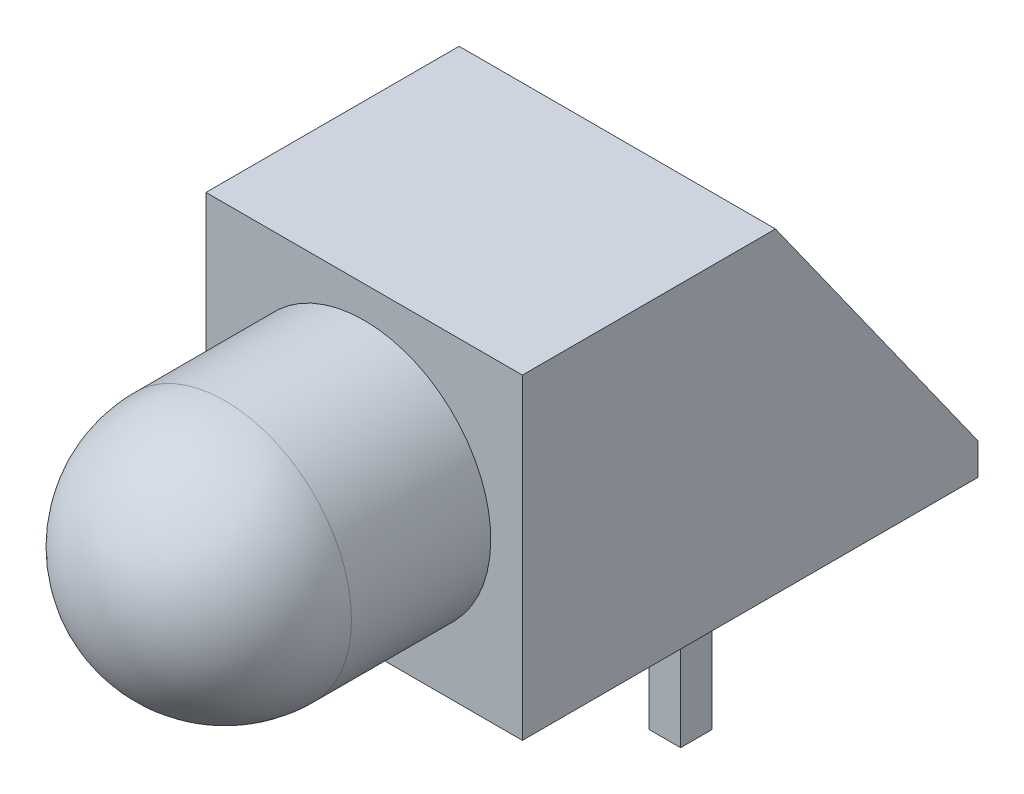
ISO-10303-21;
HEADER;
FILE_DESCRIPTION(('STEP AP214'),'2;1');
FILE_NAME('part.step','',(''),(''),'','','');
FILE_SCHEMA(('AUTOMOTIVE_DESIGN { 1 0 10303 214 1 1 1 1 }'));
ENDSEC;
DATA;
#1=APPLICATION_CONTEXT('core data for automotive mechanical design processes');
#2=APPLICATION_PROTOCOL_DEFINITION('international standard','automotive_design',2000,#1);
#3=PRODUCT_CONTEXT('',#1,'mechanical');
#4=PRODUCT('Part','Part','',(#3));
#5=PRODUCT_RELATED_PRODUCT_CATEGORY('part','',(#4));
#6=PRODUCT_DEFINITION_FORMATION('','',#4);
#7=PRODUCT_DEFINITION_CONTEXT('part definition',#1,'design');
#8=PRODUCT_DEFINITION('design','',#6,#7);
#9=PRODUCT_DEFINITION_SHAPE('','',#8);
#10=(LENGTH_UNIT() NAMED_UNIT(*) SI_UNIT(.MILLI.,.METRE.));
#11=(NAMED_UNIT(*) PLANE_ANGLE_UNIT() SI_UNIT($,.RADIAN.));
#12=(NAMED_UNIT(*) SI_UNIT($,.STERADIAN.) SOLID_ANGLE_UNIT());
#13=UNCERTAINTY_MEASURE_WITH_UNIT(LENGTH_MEASURE(1.E-05),#10,'distance_accuracy_value','');
#14=(GEOMETRIC_REPRESENTATION_CONTEXT(3) GLOBAL_UNCERTAINTY_ASSIGNED_CONTEXT((#13)) GLOBAL_UNIT_ASSIGNED_CONTEXT((#10,
#11,#12)) REPRESENTATION_CONTEXT('',''));
#15=CARTESIAN_POINT('',(0.,0.,0.));
#16=DIRECTION('',(0.,0.,1.));
#17=DIRECTION('',(1.,0.,0.));
#18=AXIS2_PLACEMENT_3D('',#15,#16,#17);
#19=CARTESIAN_POINT('',(1.27,-3.2766,0.));
#20=DIRECTION('',(0.,-1.,0.));
#21=DIRECTION('',(0.,0.,-1.));
#22=AXIS2_PLACEMENT_3D('',#19,#20,#21);
#23=PLANE('',#22);
#24=CARTESIAN_POINT('',(1.27,-3.2766,0.));
#25=DIRECTION('',(0.,-1.,0.));
#26=DIRECTION('',(0.,0.,-1.));
#27=AXIS2_PLACEMENT_3D('',#24,#25,#26);
#28=CIRCLE('',#27,0.105833333333333);
#29=CARTESIAN_POINT('',(1.27,-3.2766,-0.105833333333333));
#30=VERTEX_POINT('',#29);
#31=EDGE_CURVE('P0_E20',#30,#30,#28,.T.);
#32=ORIENTED_EDGE('',*,*,#31,.T.);
#33=EDGE_LOOP('',(#32));
#34=FACE_BOUND('',#33,.T.);
#35=ADVANCED_FACE('P0_F17',(#34),#23,.T.);
#36=CARTESIAN_POINT('',(1.27,-3.2766,0.));
#37=DIRECTION('',(0.,-1.,0.));
#38=DIRECTION('',(0.,0.,-1.));
#39=AXIS2_PLACEMENT_3D('',#36,#37,#38);
#40=CYLINDRICAL_SURFACE('',#39,0.105833333333333);
#41=ORIENTED_EDGE('',*,*,#31,.F.);
#42=EDGE_LOOP('',(#41));
#43=FACE_BOUND('',#42,.T.);
#44=CARTESIAN_POINT('',(1.27,-3.302,0.));
#45=DIRECTION('',(0.,-1.,0.));
#46=DIRECTION('',(0.,0.,-1.));
#47=AXIS2_PLACEMENT_3D('',#44,#45,#46);
#48=CIRCLE('',#47,0.105833333333333);
#49=CARTESIAN_POINT('',(1.27,-3.302,-0.105833333333333));
#50=VERTEX_POINT('',#49);
#51=EDGE_CURVE('P0_E79',#50,#50,#48,.F.);
#52=ORIENTED_EDGE('',*,*,#51,.F.);
#53=EDGE_LOOP('',(#52));
#54=FACE_BOUND('',#53,.T.);
#55=ADVANCED_FACE('P0_F115',(#43,#54),#40,.F.);
#56=CARTESIAN_POINT('',(1.5875,-3.302,0.3175));
#57=DIRECTION('',(0.,0.,-1.));
#58=DIRECTION('',(-1.,0.,0.));
#59=AXIS2_PLACEMENT_3D('',#56,#57,#58);
#60=PLANE('',#59);
#61=DIRECTION('',(1.,0.,0.));
#62=VECTOR('',#61,1.);
#63=CARTESIAN_POINT('',(1.5875,-3.302,0.3175));
#64=LINE('',#63,#62);
#65=CARTESIAN_POINT('',(1.5875,-3.302,0.3175));
#66=VERTEX_POINT('',#65);
#67=CARTESIAN_POINT('',(0.9525,-3.302,0.3175));
#68=VERTEX_POINT('',#67);
#69=EDGE_CURVE('P0_E82',#66,#68,#64,.F.);
#70=ORIENTED_EDGE('',*,*,#69,.F.);
#71=DIRECTION('',(0.,1.,0.));
#72=VECTOR('',#71,1.);
#73=CARTESIAN_POINT('',(1.5875,-3.302,0.3175));
#74=LINE('',#73,#72);
#75=CARTESIAN_POINT('',(1.5875,0.,0.3175));
#76=VERTEX_POINT('',#75);
#77=EDGE_CURVE('P0_E60',#66,#76,#74,.T.);
#78=ORIENTED_EDGE('',*,*,#77,.T.);
#79=DIRECTION('',(1.,0.,0.));
#80=VECTOR('',#79,1.);
#81=CARTESIAN_POINT('',(1.5875,0.,0.3175));
#82=LINE('',#81,#80);
#83=CARTESIAN_POINT('',(0.9525,0.,0.3175));
#84=VERTEX_POINT('',#83);
#85=EDGE_CURVE('P0_E58',#76,#84,#82,.F.);
#86=ORIENTED_EDGE('',*,*,#85,.T.);
#87=DIRECTION('',(0.,1.,0.));
#88=VECTOR('',#87,1.);
#89=CARTESIAN_POINT('',(0.9525,-3.302,0.3175));
#90=LINE('',#89,#88);
#91=EDGE_CURVE('P0_E55',#84,#68,#90,.F.);
#92=ORIENTED_EDGE('',*,*,#91,.T.);
#93=EDGE_LOOP('',(#70,#78,#86,#92));
#94=FACE_BOUND('',#93,.T.);
#95=ADVANCED_FACE('P0_F59',(#94),#60,.F.);
#96=CARTESIAN_POINT('',(1.5875,0.,0.3175));
#97=DIRECTION('',(0.,-1.,0.));
#98=DIRECTION('',(0.,0.,-1.));
#99=AXIS2_PLACEMENT_3D('',#96,#97,#98);
#100=PLANE('',#99);
#101=DIRECTION('',(0.,0.,-1.));
#102=VECTOR('',#101,1.);
#103=CARTESIAN_POINT('',(0.9525,0.,-0.3175));
#104=LINE('',#103,#102);
#105=CARTESIAN_POINT('',(0.9525,0.,-0.3175));
#106=VERTEX_POINT('',#105);
#107=EDGE_CURVE('P0_E65',#106,#84,#104,.F.);
#108=ORIENTED_EDGE('',*,*,#107,.T.);
#109=ORIENTED_EDGE('',*,*,#85,.F.);
#110=DIRECTION('',(0.,0.,1.));
#111=VECTOR('',#110,1.);
#112=CARTESIAN_POINT('',(1.5875,0.,-0.3175));
#113=LINE('',#112,#111);
#114=CARTESIAN_POINT('',(1.5875,0.,-0.3175));
#115=VERTEX_POINT('',#114);
#116=EDGE_CURVE('P0_E81',#76,#115,#113,.F.);
#117=ORIENTED_EDGE('',*,*,#116,.T.);
#118=DIRECTION('',(1.,0.,0.));
#119=VECTOR('',#118,1.);
#120=CARTESIAN_POINT('',(1.5875,0.,-0.3175));
#121=LINE('',#120,#119);
#122=EDGE_CURVE('P0_E76',#115,#106,#121,.F.);
#123=ORIENTED_EDGE('',*,*,#122,.T.);
#124=EDGE_LOOP('',(#108,#109,#117,#123));
#125=FACE_BOUND('',#124,.T.);
#126=ADVANCED_FACE('P0_F75',(#125),#100,.F.);
#127=CARTESIAN_POINT('',(0.9525,-3.302,-0.3175));
#128=DIRECTION('',(1.,0.,0.));
#129=DIRECTION('',(0.,0.,-1.));
#130=AXIS2_PLACEMENT_3D('',#127,#128,#129);
#131=PLANE('',#130);
#132=DIRECTION('',(0.,0.,-1.));
#133=VECTOR('',#132,1.);
#134=CARTESIAN_POINT('',(0.9525,-3.302,0.3175));
#135=LINE('',#134,#133);
#136=CARTESIAN_POINT('',(0.9525,-3.302,-0.3175));
#137=VERTEX_POINT('',#136);
#138=EDGE_CURVE('P0_E72',#68,#137,#135,.T.);
#139=ORIENTED_EDGE('',*,*,#138,.F.);
#140=ORIENTED_EDGE('',*,*,#91,.F.);
#141=ORIENTED_EDGE('',*,*,#107,.F.);
#142=DIRECTION('',(0.,1.,0.));
#143=VECTOR('',#142,1.);
#144=CARTESIAN_POINT('',(0.9525,-3.302,-0.3175));
#145=LINE('',#144,#143);
#146=EDGE_CURVE('P0_E92',#106,#137,#145,.F.);
#147=ORIENTED_EDGE('',*,*,#146,.T.);
#148=EDGE_LOOP('',(#139,#140,#141,#147));
#149=FACE_BOUND('',#148,.T.);
#150=ADVANCED_FACE('P0_F69',(#149),#131,.F.);
#151=CARTESIAN_POINT('',(1.5875,-3.302,0.3175));
#152=DIRECTION('',(0.,-1.,0.));
#153=DIRECTION('',(0.,0.,-1.));
#154=AXIS2_PLACEMENT_3D('',#151,#152,#153);
#155=PLANE('',#154);
#156=ORIENTED_EDGE('',*,*,#51,.T.);
#157=EDGE_LOOP('',(#156));
#158=FACE_BOUND('',#157,.T.);
#159=DIRECTION('',(0.,0.,1.));
#160=VECTOR('',#159,1.);
#161=CARTESIAN_POINT('',(1.5875,-3.302,-0.3175));
#162=LINE('',#161,#160);
#163=CARTESIAN_POINT('',(1.5875,-3.302,-0.3175));
#164=VERTEX_POINT('',#163);
#165=EDGE_CURVE('P0_E34',#164,#66,#162,.T.);
#166=ORIENTED_EDGE('',*,*,#165,.T.);
#167=ORIENTED_EDGE('',*,*,#69,.T.);
#168=ORIENTED_EDGE('',*,*,#138,.T.);
#169=DIRECTION('',(1.,0.,0.));
#170=VECTOR('',#169,1.);
#171=CARTESIAN_POINT('',(1.5875,-3.302,-0.3175));
#172=LINE('',#171,#170);
#173=EDGE_CURVE('P0_E26',#137,#164,#172,.T.);
#174=ORIENTED_EDGE('',*,*,#173,.T.);
#175=EDGE_LOOP('',(#166,#167,#168,#174));
#176=FACE_BOUND('',#175,.T.);
#177=ADVANCED_FACE('P0_F96',(#158,#176),#155,.T.);
#178=CARTESIAN_POINT('',(1.5875,-3.302,-0.3175));
#179=DIRECTION('',(-1.,0.,0.));
#180=DIRECTION('',(0.,0.,1.));
#181=AXIS2_PLACEMENT_3D('',#178,#179,#180);
#182=PLANE('',#181);
#183=ORIENTED_EDGE('',*,*,#165,.F.);
#184=DIRECTION('',(0.,1.,0.));
#185=VECTOR('',#184,1.);
#186=CARTESIAN_POINT('',(1.5875,-3.302,-0.3175));
#187=LINE('',#186,#185);
#188=EDGE_CURVE('P0_E11',#164,#115,#187,.T.);
#189=ORIENTED_EDGE('',*,*,#188,.T.);
#190=ORIENTED_EDGE('',*,*,#116,.F.);
#191=ORIENTED_EDGE('',*,*,#77,.F.);
#192=EDGE_LOOP('',(#183,#189,#190,#191));
#193=FACE_BOUND('',#192,.T.);
#194=ADVANCED_FACE('P0_F99',(#193),#182,.F.);
#195=CARTESIAN_POINT('',(1.5875,-3.302,-0.3175));
#196=DIRECTION('',(0.,0.,1.));
#197=DIRECTION('',(1.,0.,0.));
#198=AXIS2_PLACEMENT_3D('',#195,#196,#197);
#199=PLANE('',#198);
#200=ORIENTED_EDGE('',*,*,#173,.F.);
#201=ORIENTED_EDGE('',*,*,#146,.F.);
#202=ORIENTED_EDGE('',*,*,#122,.F.);
#203=ORIENTED_EDGE('',*,*,#188,.F.);
#204=EDGE_LOOP('',(#200,#201,#202,#203));
#205=FACE_BOUND('',#204,.T.);
#206=ADVANCED_FACE('P0_F98',(#205),#199,.F.);
#207=CLOSED_SHELL('',(#35,#55,#95,#126,#150,#177,#194,#206));
#208=MANIFOLD_SOLID_BREP('P0_B1',#207);
#209=CARTESIAN_POINT('',(-3.175,6.35,-4.064));
#210=DIRECTION('',(0.,-1.,0.));
#211=DIRECTION('',(0.,0.,-1.));
#212=AXIS2_PLACEMENT_3D('',#209,#210,#211);
#213=PLANE('',#212);
#214=DIRECTION('',(0.,0.,-1.));
#215=VECTOR('',#214,1.);
#216=CARTESIAN_POINT('',(-3.175,6.35,5.08));
#217=LINE('',#216,#215);
#218=CARTESIAN_POINT('',(-3.175,6.35,0.));
#219=VERTEX_POINT('',#218);
#220=CARTESIAN_POINT('',(-3.175,6.35,5.08));
#221=VERTEX_POINT('',#220);
#222=EDGE_CURVE('P1_E85',#219,#221,#217,.F.);
#223=ORIENTED_EDGE('',*,*,#222,.T.);
#224=DIRECTION('',(-1.,0.,0.));
#225=VECTOR('',#224,1.);
#226=CARTESIAN_POINT('',(-3.175,6.35,5.08));
#227=LINE('',#226,#225);
#228=CARTESIAN_POINT('',(3.175,6.35,5.08));
#229=VERTEX_POINT('',#228);
#230=EDGE_CURVE('P1_E61',#221,#229,#227,.F.);
#231=ORIENTED_EDGE('',*,*,#230,.T.);
#232=DIRECTION('',(0.,0.,1.));
#233=VECTOR('',#232,1.);
#234=CARTESIAN_POINT('',(3.175,6.35,5.08));
#235=LINE('',#234,#233);
#236=CARTESIAN_POINT('',(3.175,6.35,0.));
#237=VERTEX_POINT('',#236);
#238=EDGE_CURVE('P1_E63',#229,#237,#235,.F.);
#239=ORIENTED_EDGE('',*,*,#238,.T.);
#240=DIRECTION('',(1.,0.,0.));
#241=VECTOR('',#240,1.);
#242=CARTESIAN_POINT('',(-3.175,6.35,0.));
#243=LINE('',#242,#241);
#244=EDGE_CURVE('P1_E20',#237,#219,#243,.F.);
#245=ORIENTED_EDGE('',*,*,#244,.T.);
#246=EDGE_LOOP('',(#223,#231,#239,#245));
#247=FACE_BOUND('',#246,.T.);
#248=ADVANCED_FACE('P1_F17',(#247),#213,.F.);
#249=CARTESIAN_POINT('',(-3.175,0.635,-4.064));
#250=DIRECTION('',(0.,-0.579523786360003,0.814955324568756));
#251=DIRECTION('',(0.,-0.814955324568756,-0.579523786360003));
#252=AXIS2_PLACEMENT_3D('',#249,#250,#251);
#253=PLANE('',#252);
#254=ORIENTED_EDGE('',*,*,#244,.F.);
#255=DIRECTION('',(0.,-0.814955324568755,-0.579523786360003));
#256=VECTOR('',#255,1.);
#257=CARTESIAN_POINT('',(3.175,6.35,0.));
#258=LINE('',#257,#256);
#259=CARTESIAN_POINT('',(3.175,0.635000000000001,-4.064));
#260=VERTEX_POINT('',#259);
#261=EDGE_CURVE('P1_E69',#237,#260,#258,.T.);
#262=ORIENTED_EDGE('',*,*,#261,.T.);
#263=DIRECTION('',(1.,0.,0.));
#264=VECTOR('',#263,1.);
#265=CARTESIAN_POINT('',(-3.175,0.635,-4.064));
#266=LINE('',#265,#264);
#267=CARTESIAN_POINT('',(-3.175,0.634999999999999,-4.064));
#268=VERTEX_POINT('',#267);
#269=EDGE_CURVE('P1_E92',#260,#268,#266,.F.);
#270=ORIENTED_EDGE('',*,*,#269,.T.);
#271=DIRECTION('',(0.,0.814955324568755,0.579523786360003));
#272=VECTOR('',#271,1.);
#273=CARTESIAN_POINT('',(-3.175,0.635,-4.064));
#274=LINE('',#273,#272);
#275=EDGE_CURVE('P1_E74',#268,#219,#274,.T.);
#276=ORIENTED_EDGE('',*,*,#275,.T.);
#277=EDGE_LOOP('',(#254,#262,#270,#276));
#278=FACE_BOUND('',#277,.T.);
#279=ADVANCED_FACE('P1_F71',(#278),#253,.F.);
#280=CARTESIAN_POINT('',(3.175,6.35,5.08));
#281=DIRECTION('',(-1.,0.,0.));
#282=DIRECTION('',(0.,0.,1.));
#283=AXIS2_PLACEMENT_3D('',#280,#281,#282);
#284=PLANE('',#283);
#285=ORIENTED_EDGE('',*,*,#238,.F.);
#286=DIRECTION('',(0.,1.,0.));
#287=VECTOR('',#286,1.);
#288=CARTESIAN_POINT('',(3.175,6.35,5.08));
#289=LINE('',#288,#287);
#290=CARTESIAN_POINT('',(3.175,0.,5.08));
#291=VERTEX_POINT('',#290);
#292=EDGE_CURVE('P1_E81',#229,#291,#289,.F.);
#293=ORIENTED_EDGE('',*,*,#292,.T.);
#294=DIRECTION('',(0.,0.,-1.));
#295=VECTOR('',#294,1.);
#296=CARTESIAN_POINT('',(3.175,0.,-4.064));
#297=LINE('',#296,#295);
#298=CARTESIAN_POINT('',(3.175,0.,-4.064));
#299=VERTEX_POINT('',#298);
#300=EDGE_CURVE('P1_E94',#299,#291,#297,.F.);
#301=ORIENTED_EDGE('',*,*,#300,.F.);
#302=DIRECTION('',(0.,1.,0.));
#303=VECTOR('',#302,1.);
#304=CARTESIAN_POINT('',(3.175,6.35,-4.064));
#305=LINE('',#304,#303);
#306=EDGE_CURVE('P1_E78',#299,#260,#305,.T.);
#307=ORIENTED_EDGE('',*,*,#306,.T.);
#308=ORIENTED_EDGE('',*,*,#261,.F.);
#309=EDGE_LOOP('',(#285,#293,#301,#307,#308));
#310=FACE_BOUND('',#309,.T.);
#311=ADVANCED_FACE('P1_F76',(#310),#284,.F.);
#312=CARTESIAN_POINT('',(-3.175,6.35,5.08));
#313=DIRECTION('',(0.,0.,-1.));
#314=DIRECTION('',(-1.,0.,0.));
#315=AXIS2_PLACEMENT_3D('',#312,#313,#314);
#316=PLANE('',#315);
#317=ORIENTED_EDGE('',*,*,#230,.F.);
#318=DIRECTION('',(0.,1.,0.));
#319=VECTOR('',#318,1.);
#320=CARTESIAN_POINT('',(-3.175,6.35,5.08));
#321=LINE('',#320,#319);
#322=CARTESIAN_POINT('',(-3.175,0.,5.08));
#323=VERTEX_POINT('',#322);
#324=EDGE_CURVE('P1_E87',#221,#323,#321,.F.);
#325=ORIENTED_EDGE('',*,*,#324,.T.);
#326=DIRECTION('',(1.,0.,0.));
#327=VECTOR('',#326,1.);
#328=CARTESIAN_POINT('',(-3.175,0.,5.08));
#329=LINE('',#328,#327);
#330=EDGE_CURVE('P1_E97',#291,#323,#329,.F.);
#331=ORIENTED_EDGE('',*,*,#330,.F.);
#332=ORIENTED_EDGE('',*,*,#292,.F.);
#333=EDGE_LOOP('',(#317,#325,#331,#332));
#334=FACE_BOUND('',#333,.T.);
#335=ADVANCED_FACE('P1_F107',(#334),#316,.F.);
#336=CARTESIAN_POINT('',(-3.175,6.35,5.08));
#337=DIRECTION('',(1.,0.,0.));
#338=DIRECTION('',(0.,0.,-1.));
#339=AXIS2_PLACEMENT_3D('',#336,#337,#338);
#340=PLANE('',#339);
#341=DIRECTION('',(0.,1.,0.));
#342=VECTOR('',#341,1.);
#343=CARTESIAN_POINT('',(-3.175,6.35,-4.064));
#344=LINE('',#343,#342);
#345=CARTESIAN_POINT('',(-3.175,0.,-4.064));
#346=VERTEX_POINT('',#345);
#347=EDGE_CURVE('P1_E35',#268,#346,#344,.F.);
#348=ORIENTED_EDGE('',*,*,#347,.T.);
#349=DIRECTION('',(0.,0.,-1.));
#350=VECTOR('',#349,1.);
#351=CARTESIAN_POINT('',(-3.175,0.,-4.064));
#352=LINE('',#351,#350);
#353=EDGE_CURVE('P1_E26',#323,#346,#352,.T.);
#354=ORIENTED_EDGE('',*,*,#353,.F.);
#355=ORIENTED_EDGE('',*,*,#324,.F.);
#356=ORIENTED_EDGE('',*,*,#222,.F.);
#357=ORIENTED_EDGE('',*,*,#275,.F.);
#358=EDGE_LOOP('',(#348,#354,#355,#356,#357));
#359=FACE_BOUND('',#358,.T.);
#360=ADVANCED_FACE('P1_F105',(#359),#340,.F.);
#361=CARTESIAN_POINT('',(-3.175,6.35,-4.064));
#362=DIRECTION('',(0.,0.,1.));
#363=DIRECTION('',(1.,0.,0.));
#364=AXIS2_PLACEMENT_3D('',#361,#362,#363);
#365=PLANE('',#364);
#366=ORIENTED_EDGE('',*,*,#306,.F.);
#367=DIRECTION('',(1.,0.,0.));
#368=VECTOR('',#367,1.);
#369=CARTESIAN_POINT('',(-3.175,0.,-4.064));
#370=LINE('',#369,#368);
#371=EDGE_CURVE('P1_E11',#346,#299,#370,.T.);
#372=ORIENTED_EDGE('',*,*,#371,.F.);
#373=ORIENTED_EDGE('',*,*,#347,.F.);
#374=ORIENTED_EDGE('',*,*,#269,.F.);
#375=EDGE_LOOP('',(#366,#372,#373,#374));
#376=FACE_BOUND('',#375,.T.);
#377=ADVANCED_FACE('P1_F109',(#376),#365,.F.);
#378=CARTESIAN_POINT('',(-3.175,0.,-4.064));
#379=DIRECTION('',(0.,-1.,0.));
#380=DIRECTION('',(0.,0.,-1.));
#381=AXIS2_PLACEMENT_3D('',#378,#379,#380);
#382=PLANE('',#381);
#383=ORIENTED_EDGE('',*,*,#353,.T.);
#384=ORIENTED_EDGE('',*,*,#371,.T.);
#385=ORIENTED_EDGE('',*,*,#300,.T.);
#386=ORIENTED_EDGE('',*,*,#330,.T.);
#387=EDGE_LOOP('',(#383,#384,#385,#386));
#388=FACE_BOUND('',#387,.T.);
#389=ADVANCED_FACE('P1_F102',(#388),#382,.T.);
#390=CLOSED_SHELL('',(#248,#279,#311,#335,#360,#377,#389));
#391=MANIFOLD_SOLID_BREP('P1_B1',#390);
#392=CARTESIAN_POINT('',(-1.27,-3.2766,0.));
#393=DIRECTION('',(0.,-1.,0.));
#394=DIRECTION('',(0.,0.,-1.));
#395=AXIS2_PLACEMENT_3D('',#392,#393,#394);
#396=PLANE('',#395);
#397=CARTESIAN_POINT('',(-1.27,-3.2766,0.));
#398=DIRECTION('',(0.,-1.,0.));
#399=DIRECTION('',(0.,0.,-1.));
#400=AXIS2_PLACEMENT_3D('',#397,#398,#399);
#401=CIRCLE('',#400,0.105833333333333);
#402=CARTESIAN_POINT('',(-1.27,-3.2766,-0.105833333333333));
#403=VERTEX_POINT('',#402);
#404=EDGE_CURVE('P2_E20',#403,#403,#401,.T.);
#405=ORIENTED_EDGE('',*,*,#404,.T.);
#406=EDGE_LOOP('',(#405));
#407=FACE_BOUND('',#406,.T.);
#408=ADVANCED_FACE('P2_F17',(#407),#396,.T.);
#409=CARTESIAN_POINT('',(-1.27,-3.2766,0.));
#410=DIRECTION('',(0.,-1.,0.));
#411=DIRECTION('',(0.,0.,-1.));
#412=AXIS2_PLACEMENT_3D('',#409,#410,#411);
#413=CYLINDRICAL_SURFACE('',#412,0.105833333333333);
#414=ORIENTED_EDGE('',*,*,#404,.F.);
#415=EDGE_LOOP('',(#414));
#416=FACE_BOUND('',#415,.T.);
#417=CARTESIAN_POINT('',(-1.27,-3.302,0.));
#418=DIRECTION('',(0.,-1.,0.));
#419=DIRECTION('',(0.,0.,-1.));
#420=AXIS2_PLACEMENT_3D('',#417,#418,#419);
#421=CIRCLE('',#420,0.105833333333333);
#422=CARTESIAN_POINT('',(-1.27,-3.302,-0.105833333333333));
#423=VERTEX_POINT('',#422);
#424=EDGE_CURVE('P2_E79',#423,#423,#421,.T.);
#425=ORIENTED_EDGE('',*,*,#424,.T.);
#426=EDGE_LOOP('',(#425));
#427=FACE_BOUND('',#426,.T.);
#428=ADVANCED_FACE('P2_F116',(#416,#427),#413,.F.);
#429=CARTESIAN_POINT('',(-1.5875,-3.302,-0.3175));
#430=DIRECTION('',(0.,0.,1.));
#431=DIRECTION('',(1.,0.,0.));
#432=AXIS2_PLACEMENT_3D('',#429,#430,#431);
#433=PLANE('',#432);
#434=DIRECTION('',(1.,0.,0.));
#435=VECTOR('',#434,1.);
#436=CARTESIAN_POINT('',(-1.5875,-3.302,-0.3175));
#437=LINE('',#436,#435);
#438=CARTESIAN_POINT('',(-0.9525,-3.302,-0.3175));
#439=VERTEX_POINT('',#438);
#440=CARTESIAN_POINT('',(-1.5875,-3.302,-0.3175));
#441=VERTEX_POINT('',#440);
#442=EDGE_CURVE('P2_E82',#439,#441,#437,.F.);
#443=ORIENTED_EDGE('',*,*,#442,.T.);
#444=DIRECTION('',(0.,1.,0.));
#445=VECTOR('',#444,1.);
#446=CARTESIAN_POINT('',(-1.5875,-3.302,-0.3175));
#447=LINE('',#446,#445);
#448=CARTESIAN_POINT('',(-1.5875,0.,-0.3175));
#449=VERTEX_POINT('',#448);
#450=EDGE_CURVE('P2_E60',#441,#449,#447,.T.);
#451=ORIENTED_EDGE('',*,*,#450,.T.);
#452=DIRECTION('',(1.,0.,0.));
#453=VECTOR('',#452,1.);
#454=CARTESIAN_POINT('',(-1.5875,0.,-0.3175));
#455=LINE('',#454,#453);
#456=CARTESIAN_POINT('',(-0.9525,0.,-0.3175));
#457=VERTEX_POINT('',#456);
#458=EDGE_CURVE('P2_E58',#457,#449,#455,.F.);
#459=ORIENTED_EDGE('',*,*,#458,.F.);
#460=DIRECTION('',(0.,1.,0.));
#461=VECTOR('',#460,1.);
#462=CARTESIAN_POINT('',(-0.9525,-3.302,-0.3175));
#463=LINE('',#462,#461);
#464=EDGE_CURVE('P2_E55',#457,#439,#463,.F.);
#465=ORIENTED_EDGE('',*,*,#464,.T.);
#466=EDGE_LOOP('',(#443,#451,#459,#465));
#467=FACE_BOUND('',#466,.T.);
#468=ADVANCED_FACE('P2_F59',(#467),#433,.F.);
#469=CARTESIAN_POINT('',(-1.5875,0.,0.3175));
#470=DIRECTION('',(0.,1.,0.));
#471=DIRECTION('',(0.,0.,1.));
#472=AXIS2_PLACEMENT_3D('',#469,#470,#471);
#473=PLANE('',#472);
#474=DIRECTION('',(0.,0.,-1.));
#475=VECTOR('',#474,1.);
#476=CARTESIAN_POINT('',(-1.5875,0.,-0.3175));
#477=LINE('',#476,#475);
#478=CARTESIAN_POINT('',(-1.5875,0.,0.3175));
#479=VERTEX_POINT('',#478);
#480=EDGE_CURVE('P2_E81',#449,#479,#477,.F.);
#481=ORIENTED_EDGE('',*,*,#480,.T.);
#482=DIRECTION('',(-1.,0.,0.));
#483=VECTOR('',#482,1.);
#484=CARTESIAN_POINT('',(-1.5875,0.,0.3175));
#485=LINE('',#484,#483);
#486=CARTESIAN_POINT('',(-0.9525,0.,0.3175));
#487=VERTEX_POINT('',#486);
#488=EDGE_CURVE('P2_E76',#479,#487,#485,.F.);
#489=ORIENTED_EDGE('',*,*,#488,.T.);
#490=DIRECTION('',(0.,0.,1.));
#491=VECTOR('',#490,1.);
#492=CARTESIAN_POINT('',(-0.9525,0.,-0.3175));
#493=LINE('',#492,#491);
#494=EDGE_CURVE('P2_E65',#487,#457,#493,.F.);
#495=ORIENTED_EDGE('',*,*,#494,.T.);
#496=ORIENTED_EDGE('',*,*,#458,.T.);
#497=EDGE_LOOP('',(#481,#489,#495,#496));
#498=FACE_BOUND('',#497,.T.);
#499=ADVANCED_FACE('P2_F75',(#498),#473,.T.);
#500=CARTESIAN_POINT('',(-0.9525,-3.302,-0.3175));
#501=DIRECTION('',(-1.,0.,0.));
#502=DIRECTION('',(0.,0.,1.));
#503=AXIS2_PLACEMENT_3D('',#500,#501,#502);
#504=PLANE('',#503);
#505=DIRECTION('',(0.,0.,1.));
#506=VECTOR('',#505,1.);
#507=CARTESIAN_POINT('',(-0.9525,-3.302,0.3175));
#508=LINE('',#507,#506);
#509=CARTESIAN_POINT('',(-0.9525,-3.302,0.3175));
#510=VERTEX_POINT('',#509);
#511=EDGE_CURVE('P2_E72',#510,#439,#508,.F.);
#512=ORIENTED_EDGE('',*,*,#511,.T.);
#513=ORIENTED_EDGE('',*,*,#464,.F.);
#514=ORIENTED_EDGE('',*,*,#494,.F.);
#515=DIRECTION('',(0.,1.,0.));
#516=VECTOR('',#515,1.);
#517=CARTESIAN_POINT('',(-0.9525,-3.302,0.3175));
#518=LINE('',#517,#516);
#519=EDGE_CURVE('P2_E91',#487,#510,#518,.F.);
#520=ORIENTED_EDGE('',*,*,#519,.T.);
#521=EDGE_LOOP('',(#512,#513,#514,#520));
#522=FACE_BOUND('',#521,.T.);
#523=ADVANCED_FACE('P2_F69',(#522),#504,.F.);
#524=CARTESIAN_POINT('',(-1.5875,-3.302,0.3175));
#525=DIRECTION('',(0.,1.,0.));
#526=DIRECTION('',(0.,0.,1.));
#527=AXIS2_PLACEMENT_3D('',#524,#525,#526);
#528=PLANE('',#527);
#529=ORIENTED_EDGE('',*,*,#424,.F.);
#530=EDGE_LOOP('',(#529));
#531=FACE_BOUND('',#530,.T.);
#532=ORIENTED_EDGE('',*,*,#511,.F.);
#533=DIRECTION('',(-1.,0.,0.));
#534=VECTOR('',#533,1.);
#535=CARTESIAN_POINT('',(-1.5875,-3.302,0.3175));
#536=LINE('',#535,#534);
#537=CARTESIAN_POINT('',(-1.5875,-3.302,0.3175));
#538=VERTEX_POINT('',#537);
#539=EDGE_CURVE('P2_E26',#510,#538,#536,.T.);
#540=ORIENTED_EDGE('',*,*,#539,.T.);
#541=DIRECTION('',(0.,0.,-1.));
#542=VECTOR('',#541,1.);
#543=CARTESIAN_POINT('',(-1.5875,-3.302,-0.3175));
#544=LINE('',#543,#542);
#545=EDGE_CURVE('P2_E34',#538,#441,#544,.T.);
#546=ORIENTED_EDGE('',*,*,#545,.T.);
#547=ORIENTED_EDGE('',*,*,#442,.F.);
#548=EDGE_LOOP('',(#532,#540,#546,#547));
#549=FACE_BOUND('',#548,.T.);
#550=ADVANCED_FACE('P2_F96',(#531,#549),#528,.F.);
#551=CARTESIAN_POINT('',(-1.5875,-3.302,-0.3175));
#552=DIRECTION('',(1.,0.,0.));
#553=DIRECTION('',(0.,0.,-1.));
#554=AXIS2_PLACEMENT_3D('',#551,#552,#553);
#555=PLANE('',#554);
#556=ORIENTED_EDGE('',*,*,#545,.F.);
#557=DIRECTION('',(0.,1.,0.));
#558=VECTOR('',#557,1.);
#559=CARTESIAN_POINT('',(-1.5875,-3.302,0.3175));
#560=LINE('',#559,#558);
#561=EDGE_CURVE('P2_E11',#538,#479,#560,.T.);
#562=ORIENTED_EDGE('',*,*,#561,.T.);
#563=ORIENTED_EDGE('',*,*,#480,.F.);
#564=ORIENTED_EDGE('',*,*,#450,.F.);
#565=EDGE_LOOP('',(#556,#562,#563,#564));
#566=FACE_BOUND('',#565,.T.);
#567=ADVANCED_FACE('P2_F99',(#566),#555,.F.);
#568=CARTESIAN_POINT('',(-1.5875,-3.302,0.3175));
#569=DIRECTION('',(0.,0.,-1.));
#570=DIRECTION('',(-1.,0.,0.));
#571=AXIS2_PLACEMENT_3D('',#568,#569,#570);
#572=PLANE('',#571);
#573=ORIENTED_EDGE('',*,*,#539,.F.);
#574=ORIENTED_EDGE('',*,*,#519,.F.);
#575=ORIENTED_EDGE('',*,*,#488,.F.);
#576=ORIENTED_EDGE('',*,*,#561,.F.);
#577=EDGE_LOOP('',(#573,#574,#575,#576));
#578=FACE_BOUND('',#577,.T.);
#579=ADVANCED_FACE('P2_F98',(#578),#572,.F.);
#580=CLOSED_SHELL('',(#408,#428,#468,#499,#523,#550,#567,#579));
#581=MANIFOLD_SOLID_BREP('P2_B1',#580);
#582=CARTESIAN_POINT('',(0.,5.715,5.08));
#583=DIRECTION('',(0.,0.,-1.));
#584=DIRECTION('',(0.,1.,0.));
#585=AXIS2_PLACEMENT_3D('',#582,#583,#584);
#586=PLANE('',#585);
#587=CARTESIAN_POINT('',(0.,3.175,5.08));
#588=DIRECTION('',(0.,0.,-1.));
#589=DIRECTION('',(0.,1.,0.));
#590=AXIS2_PLACEMENT_3D('',#587,#588,#589);
#591=CIRCLE('',#590,2.54);
#592=CARTESIAN_POINT('',(0.,5.715,5.08));
#593=VERTEX_POINT('',#592);
#594=EDGE_CURVE('P3_E19',#593,#593,#591,.F.);
#595=ORIENTED_EDGE('',*,*,#594,.F.);
#596=EDGE_LOOP('',(#595));
#597=FACE_BOUND('',#596,.T.);
#598=ADVANCED_FACE('P3_F15',(#597),#586,.T.);
#599=CARTESIAN_POINT('',(0.,3.175,5.08));
#600=DIRECTION('',(0.,0.,-1.));
#601=DIRECTION('',(0.,1.,0.));
#602=AXIS2_PLACEMENT_3D('',#599,#600,#601);
#603=CYLINDRICAL_SURFACE('',#602,2.54);
#604=ORIENTED_EDGE('',*,*,#594,.T.);
#605=EDGE_LOOP('',(#604));
#606=FACE_BOUND('',#605,.T.);
#607=CARTESIAN_POINT('',(0.,3.175,7.874));
#608=DIRECTION('',(0.,0.,1.));
#609=DIRECTION('',(0.,1.,0.));
#610=AXIS2_PLACEMENT_3D('',#607,#608,#609);
#611=CIRCLE('',#610,2.54);
#612=CARTESIAN_POINT('',(0.,5.715,7.874));
#613=VERTEX_POINT('',#612);
#614=EDGE_CURVE('P3_E10',#613,#613,#611,.T.);
#615=ORIENTED_EDGE('',*,*,#614,.F.);
#616=EDGE_LOOP('',(#615));
#617=FACE_BOUND('',#616,.T.);
#618=ADVANCED_FACE('P3_F30',(#606,#617),#603,.T.);
#619=CARTESIAN_POINT('',(0.,3.175,7.874));
#620=DIRECTION('',(0.,1.,0.));
#621=DIRECTION('',(1.,0.,0.));
#622=AXIS2_PLACEMENT_3D('',#619,#620,#621);
#623=SPHERICAL_SURFACE('',#622,2.54);
#624=ORIENTED_EDGE('',*,*,#614,.T.);
#625=EDGE_LOOP('',(#624));
#626=FACE_BOUND('',#625,.T.);
#627=ADVANCED_FACE('P3_F17',(#626),#623,.T.);
#628=CLOSED_SHELL('',(#598,#618,#627));
#629=MANIFOLD_SOLID_BREP('P3_B1',#628);
#630=ADVANCED_BREP_SHAPE_REPRESENTATION('',(#18,#208,#391,#581,#629),#14);
#631=SHAPE_DEFINITION_REPRESENTATION(#9,#630);
ENDSEC;
END-ISO-10303-21;
